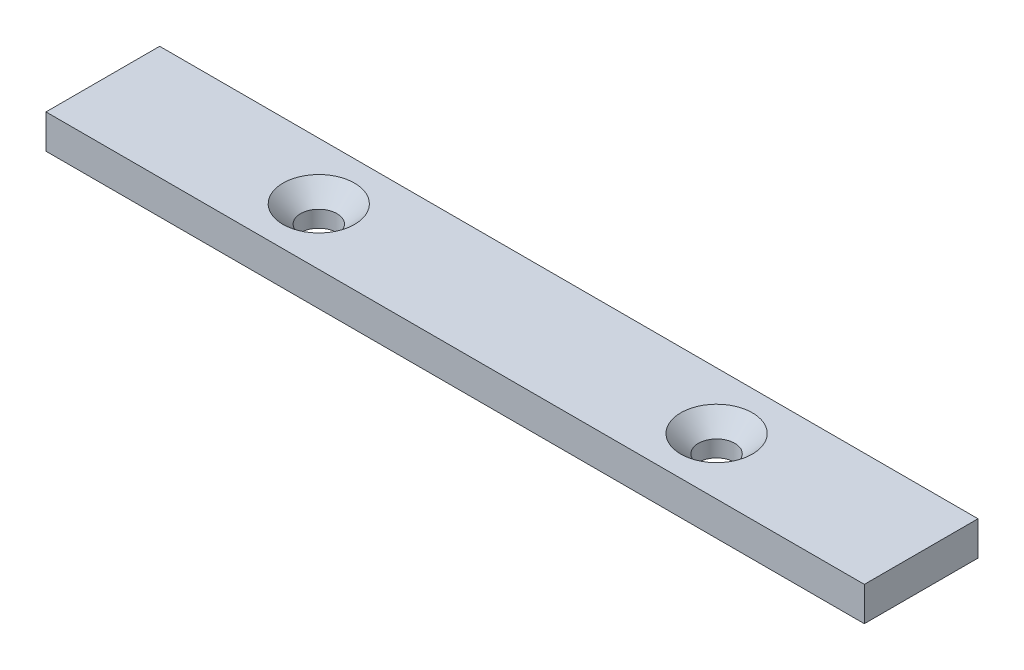
ISO-10303-21;
HEADER;
FILE_DESCRIPTION(('STEP AP214'),'2;1');
FILE_NAME('part.step','',(''),(''),'','','');
FILE_SCHEMA(('AUTOMOTIVE_DESIGN { 1 0 10303 214 1 1 1 1 }'));
ENDSEC;
DATA;
#1=APPLICATION_CONTEXT('core data for automotive mechanical design processes');
#2=APPLICATION_PROTOCOL_DEFINITION('international standard','automotive_design',2000,#1);
#3=PRODUCT_CONTEXT('',#1,'mechanical');
#4=PRODUCT('Part','Part','',(#3));
#5=PRODUCT_RELATED_PRODUCT_CATEGORY('part','',(#4));
#6=PRODUCT_DEFINITION_FORMATION('','',#4);
#7=PRODUCT_DEFINITION_CONTEXT('part definition',#1,'design');
#8=PRODUCT_DEFINITION('design','',#6,#7);
#9=PRODUCT_DEFINITION_SHAPE('','',#8);
#10=(LENGTH_UNIT() NAMED_UNIT(*) SI_UNIT(.MILLI.,.METRE.));
#11=(NAMED_UNIT(*) PLANE_ANGLE_UNIT() SI_UNIT($,.RADIAN.));
#12=(NAMED_UNIT(*) SI_UNIT($,.STERADIAN.) SOLID_ANGLE_UNIT());
#13=UNCERTAINTY_MEASURE_WITH_UNIT(LENGTH_MEASURE(1.E-05),#10,'distance_accuracy_value','');
#14=(GEOMETRIC_REPRESENTATION_CONTEXT(3) GLOBAL_UNCERTAINTY_ASSIGNED_CONTEXT((#13)) GLOBAL_UNIT_ASSIGNED_CONTEXT((#10,
#11,#12)) REPRESENTATION_CONTEXT('',''));
#15=CARTESIAN_POINT('',(0.,0.,0.));
#16=DIRECTION('',(0.,0.,1.));
#17=DIRECTION('',(1.,0.,0.));
#18=AXIS2_PLACEMENT_3D('',#15,#16,#17);
#19=CARTESIAN_POINT('',(0.,6.,0.));
#20=DIRECTION('',(0.,0.,1.));
#21=DIRECTION('',(1.,0.,0.));
#22=AXIS2_PLACEMENT_3D('',#19,#20,#21);
#23=PLANE('',#22);
#24=DIRECTION('',(-1.,0.,0.));
#25=VECTOR('',#24,1.);
#26=CARTESIAN_POINT('',(0.,0.,0.));
#27=LINE('',#26,#25);
#28=CARTESIAN_POINT('',(144.,0.,0.));
#29=VERTEX_POINT('',#28);
#30=CARTESIAN_POINT('',(0.,0.,0.));
#31=VERTEX_POINT('',#30);
#32=EDGE_CURVE('E99',#29,#31,#27,.T.);
#33=ORIENTED_EDGE('',*,*,#32,.T.);
#34=DIRECTION('',(0.,-1.,0.));
#35=VECTOR('',#34,1.);
#36=CARTESIAN_POINT('',(0.,6.,0.));
#37=LINE('',#36,#35);
#38=CARTESIAN_POINT('',(0.,6.,0.));
#39=VERTEX_POINT('',#38);
#40=EDGE_CURVE('E11',#39,#31,#37,.T.);
#41=ORIENTED_EDGE('',*,*,#40,.F.);
#42=DIRECTION('',(-1.,0.,0.));
#43=VECTOR('',#42,1.);
#44=CARTESIAN_POINT('',(0.,6.,0.));
#45=LINE('',#44,#43);
#46=CARTESIAN_POINT('',(144.,6.,0.));
#47=VERTEX_POINT('',#46);
#48=EDGE_CURVE('E87',#47,#39,#45,.T.);
#49=ORIENTED_EDGE('',*,*,#48,.F.);
#50=DIRECTION('',(0.,-1.,0.));
#51=VECTOR('',#50,1.);
#52=CARTESIAN_POINT('',(144.,6.,0.));
#53=LINE('',#52,#51);
#54=EDGE_CURVE('E95',#47,#29,#53,.T.);
#55=ORIENTED_EDGE('',*,*,#54,.T.);
#56=EDGE_LOOP('',(#33,#41,#49,#55));
#57=FACE_BOUND('',#56,.T.);
#58=ADVANCED_FACE('F36',(#57),#23,.F.);
#59=CARTESIAN_POINT('',(0.,6.,0.));
#60=DIRECTION('',(1.,0.,0.));
#61=DIRECTION('',(0.,0.,-1.));
#62=AXIS2_PLACEMENT_3D('',#59,#60,#61);
#63=PLANE('',#62);
#64=DIRECTION('',(0.,0.,1.));
#65=VECTOR('',#64,1.);
#66=CARTESIAN_POINT('',(0.,0.,0.));
#67=LINE('',#66,#65);
#68=CARTESIAN_POINT('',(0.,0.,20.));
#69=VERTEX_POINT('',#68);
#70=EDGE_CURVE('E91',#31,#69,#67,.T.);
#71=ORIENTED_EDGE('',*,*,#70,.T.);
#72=DIRECTION('',(0.,-1.,0.));
#73=VECTOR('',#72,1.);
#74=CARTESIAN_POINT('',(0.,6.,20.));
#75=LINE('',#74,#73);
#76=CARTESIAN_POINT('',(0.,6.,20.));
#77=VERTEX_POINT('',#76);
#78=EDGE_CURVE('E44',#77,#69,#75,.T.);
#79=ORIENTED_EDGE('',*,*,#78,.F.);
#80=DIRECTION('',(0.,0.,1.));
#81=VECTOR('',#80,1.);
#82=CARTESIAN_POINT('',(0.,6.,0.));
#83=LINE('',#82,#81);
#84=EDGE_CURVE('E82',#39,#77,#83,.T.);
#85=ORIENTED_EDGE('',*,*,#84,.F.);
#86=ORIENTED_EDGE('',*,*,#40,.T.);
#87=EDGE_LOOP('',(#71,#79,#85,#86));
#88=FACE_BOUND('',#87,.T.);
#89=ADVANCED_FACE('F90',(#88),#63,.F.);
#90=CARTESIAN_POINT('',(0.,6.,20.));
#91=DIRECTION('',(0.,0.,-1.));
#92=DIRECTION('',(-1.,0.,0.));
#93=AXIS2_PLACEMENT_3D('',#90,#91,#92);
#94=PLANE('',#93);
#95=DIRECTION('',(1.,0.,0.));
#96=VECTOR('',#95,1.);
#97=CARTESIAN_POINT('',(0.,0.,20.));
#98=LINE('',#97,#96);
#99=CARTESIAN_POINT('',(144.,0.,20.));
#100=VERTEX_POINT('',#99);
#101=EDGE_CURVE('E69',#69,#100,#98,.T.);
#102=ORIENTED_EDGE('',*,*,#101,.T.);
#103=DIRECTION('',(0.,-1.,0.));
#104=VECTOR('',#103,1.);
#105=CARTESIAN_POINT('',(144.,6.,20.));
#106=LINE('',#105,#104);
#107=CARTESIAN_POINT('',(144.,6.,20.));
#108=VERTEX_POINT('',#107);
#109=EDGE_CURVE('E92',#108,#100,#106,.T.);
#110=ORIENTED_EDGE('',*,*,#109,.F.);
#111=DIRECTION('',(1.,0.,0.));
#112=VECTOR('',#111,1.);
#113=CARTESIAN_POINT('',(0.,6.,20.));
#114=LINE('',#113,#112);
#115=EDGE_CURVE('E85',#77,#108,#114,.T.);
#116=ORIENTED_EDGE('',*,*,#115,.F.);
#117=ORIENTED_EDGE('',*,*,#78,.T.);
#118=EDGE_LOOP('',(#102,#110,#116,#117));
#119=FACE_BOUND('',#118,.T.);
#120=ADVANCED_FACE('F93',(#119),#94,.F.);
#121=CARTESIAN_POINT('',(144.,6.,20.));
#122=DIRECTION('',(-1.,0.,0.));
#123=DIRECTION('',(0.,0.,1.));
#124=AXIS2_PLACEMENT_3D('',#121,#122,#123);
#125=PLANE('',#124);
#126=DIRECTION('',(0.,0.,-1.));
#127=VECTOR('',#126,1.);
#128=CARTESIAN_POINT('',(144.,0.,20.));
#129=LINE('',#128,#127);
#130=EDGE_CURVE('E75',#100,#29,#129,.T.);
#131=ORIENTED_EDGE('',*,*,#130,.T.);
#132=ORIENTED_EDGE('',*,*,#54,.F.);
#133=DIRECTION('',(0.,0.,-1.));
#134=VECTOR('',#133,1.);
#135=CARTESIAN_POINT('',(144.,6.,20.));
#136=LINE('',#135,#134);
#137=EDGE_CURVE('E52',#108,#47,#136,.T.);
#138=ORIENTED_EDGE('',*,*,#137,.F.);
#139=ORIENTED_EDGE('',*,*,#109,.T.);
#140=EDGE_LOOP('',(#131,#132,#138,#139));
#141=FACE_BOUND('',#140,.T.);
#142=ADVANCED_FACE('F107',(#141),#125,.F.);
#143=CARTESIAN_POINT('',(0.,6.,0.));
#144=DIRECTION('',(0.,1.,0.));
#145=DIRECTION('',(0.,0.,1.));
#146=AXIS2_PLACEMENT_3D('',#143,#144,#145);
#147=PLANE('',#146);
#148=CARTESIAN_POINT('',(38.,6.,10.));
#149=DIRECTION('',(0.,1.,0.));
#150=DIRECTION('',(0.,0.,1.));
#151=AXIS2_PLACEMENT_3D('',#148,#149,#150);
#152=CIRCLE('',#151,6.3);
#153=CARTESIAN_POINT('',(38.,6.,16.3));
#154=VERTEX_POINT('',#153);
#155=EDGE_CURVE('E127',#154,#154,#152,.T.);
#156=ORIENTED_EDGE('',*,*,#155,.F.);
#157=EDGE_LOOP('',(#156));
#158=FACE_BOUND('',#157,.T.);
#159=CARTESIAN_POINT('',(108.,6.,10.));
#160=DIRECTION('',(0.,1.,0.));
#161=DIRECTION('',(0.,0.,1.));
#162=AXIS2_PLACEMENT_3D('',#159,#160,#161);
#163=CIRCLE('',#162,6.3);
#164=CARTESIAN_POINT('',(108.,6.,16.3));
#165=VERTEX_POINT('',#164);
#166=EDGE_CURVE('E118',#165,#165,#163,.T.);
#167=ORIENTED_EDGE('',*,*,#166,.F.);
#168=EDGE_LOOP('',(#167));
#169=FACE_BOUND('',#168,.T.);
#170=ORIENTED_EDGE('',*,*,#48,.T.);
#171=ORIENTED_EDGE('',*,*,#84,.T.);
#172=ORIENTED_EDGE('',*,*,#115,.T.);
#173=ORIENTED_EDGE('',*,*,#137,.T.);
#174=EDGE_LOOP('',(#170,#171,#172,#173));
#175=FACE_BOUND('',#174,.T.);
#176=ADVANCED_FACE('F83',(#158,#169,#175),#147,.T.);
#177=CARTESIAN_POINT('',(0.,0.,0.));
#178=DIRECTION('',(0.,1.,0.));
#179=DIRECTION('',(0.,0.,1.));
#180=AXIS2_PLACEMENT_3D('',#177,#178,#179);
#181=PLANE('',#180);
#182=CARTESIAN_POINT('',(38.,0.,10.));
#183=DIRECTION('',(0.,1.,0.));
#184=DIRECTION('',(0.,0.,1.));
#185=AXIS2_PLACEMENT_3D('',#182,#183,#184);
#186=CIRCLE('',#185,3.19999999999999);
#187=CARTESIAN_POINT('',(38.,0.,13.2));
#188=VERTEX_POINT('',#187);
#189=EDGE_CURVE('E121',#188,#188,#186,.T.);
#190=ORIENTED_EDGE('',*,*,#189,.T.);
#191=EDGE_LOOP('',(#190));
#192=FACE_BOUND('',#191,.T.);
#193=CARTESIAN_POINT('',(108.,0.,10.));
#194=DIRECTION('',(0.,1.,0.));
#195=DIRECTION('',(0.,0.,1.));
#196=AXIS2_PLACEMENT_3D('',#193,#194,#195);
#197=CIRCLE('',#196,3.19999999999999);
#198=CARTESIAN_POINT('',(108.,0.,13.2));
#199=VERTEX_POINT('',#198);
#200=EDGE_CURVE('E102',#199,#199,#197,.T.);
#201=ORIENTED_EDGE('',*,*,#200,.T.);
#202=EDGE_LOOP('',(#201));
#203=FACE_BOUND('',#202,.T.);
#204=ORIENTED_EDGE('',*,*,#32,.F.);
#205=ORIENTED_EDGE('',*,*,#130,.F.);
#206=ORIENTED_EDGE('',*,*,#101,.F.);
#207=ORIENTED_EDGE('',*,*,#70,.F.);
#208=EDGE_LOOP('',(#204,#205,#206,#207));
#209=FACE_BOUND('',#208,.T.);
#210=ADVANCED_FACE('F110',(#192,#203,#209),#181,.F.);
#211=CARTESIAN_POINT('',(108.,6.,10.));
#212=DIRECTION('',(0.,1.,0.));
#213=DIRECTION('',(0.,0.,1.));
#214=AXIS2_PLACEMENT_3D('',#211,#212,#213);
#215=CYLINDRICAL_SURFACE('',#214,3.19999999999999);
#216=ORIENTED_EDGE('',*,*,#200,.F.);
#217=EDGE_LOOP('',(#216));
#218=FACE_BOUND('',#217,.T.);
#219=CARTESIAN_POINT('',(108.,2.9,10.));
#220=DIRECTION('',(0.,1.,0.));
#221=DIRECTION('',(0.,0.,1.));
#222=AXIS2_PLACEMENT_3D('',#219,#220,#221);
#223=CIRCLE('',#222,3.19999999999999);
#224=CARTESIAN_POINT('',(108.,2.9,13.2));
#225=VERTEX_POINT('',#224);
#226=EDGE_CURVE('E115',#225,#225,#223,.T.);
#227=ORIENTED_EDGE('',*,*,#226,.T.);
#228=EDGE_LOOP('',(#227));
#229=FACE_BOUND('',#228,.T.);
#230=ADVANCED_FACE('F141',(#218,#229),#215,.F.);
#231=CARTESIAN_POINT('',(108.,6.,10.));
#232=DIRECTION('',(0.,1.,0.));
#233=DIRECTION('',(0.,0.,1.));
#234=AXIS2_PLACEMENT_3D('',#231,#232,#233);
#235=CONICAL_SURFACE('',#234,6.3,0.785398163397449);
#236=ORIENTED_EDGE('',*,*,#226,.F.);
#237=EDGE_LOOP('',(#236));
#238=FACE_BOUND('',#237,.T.);
#239=ORIENTED_EDGE('',*,*,#166,.T.);
#240=EDGE_LOOP('',(#239));
#241=FACE_BOUND('',#240,.T.);
#242=ADVANCED_FACE('F138',(#238,#241),#235,.F.);
#243=CARTESIAN_POINT('',(38.,6.,10.));
#244=DIRECTION('',(0.,1.,0.));
#245=DIRECTION('',(0.,0.,1.));
#246=AXIS2_PLACEMENT_3D('',#243,#244,#245);
#247=CYLINDRICAL_SURFACE('',#246,3.2);
#248=ORIENTED_EDGE('',*,*,#189,.F.);
#249=EDGE_LOOP('',(#248));
#250=FACE_BOUND('',#249,.T.);
#251=CARTESIAN_POINT('',(38.,2.9,10.));
#252=DIRECTION('',(0.,1.,0.));
#253=DIRECTION('',(0.,0.,1.));
#254=AXIS2_PLACEMENT_3D('',#251,#252,#253);
#255=CIRCLE('',#254,3.2);
#256=CARTESIAN_POINT('',(38.,2.9,13.2));
#257=VERTEX_POINT('',#256);
#258=EDGE_CURVE('E124',#257,#257,#255,.T.);
#259=ORIENTED_EDGE('',*,*,#258,.T.);
#260=EDGE_LOOP('',(#259));
#261=FACE_BOUND('',#260,.T.);
#262=ADVANCED_FACE('F140',(#250,#261),#247,.F.);
#263=CARTESIAN_POINT('',(38.,6.,10.));
#264=DIRECTION('',(0.,1.,0.));
#265=DIRECTION('',(0.,0.,1.));
#266=AXIS2_PLACEMENT_3D('',#263,#264,#265);
#267=CONICAL_SURFACE('',#266,6.3,0.785398163397448);
#268=ORIENTED_EDGE('',*,*,#258,.F.);
#269=EDGE_LOOP('',(#268));
#270=FACE_BOUND('',#269,.T.);
#271=ORIENTED_EDGE('',*,*,#155,.T.);
#272=EDGE_LOOP('',(#271));
#273=FACE_BOUND('',#272,.T.);
#274=ADVANCED_FACE('F131',(#270,#273),#267,.F.);
#275=CLOSED_SHELL('',(#58,#89,#120,#142,#176,#210,#230,#242,#262,#274));
#276=MANIFOLD_SOLID_BREP('B2',#275);
#277=ADVANCED_BREP_SHAPE_REPRESENTATION('',(#18,#276),#14);
#278=SHAPE_DEFINITION_REPRESENTATION(#9,#277);
ENDSEC;
END-ISO-10303-21;
